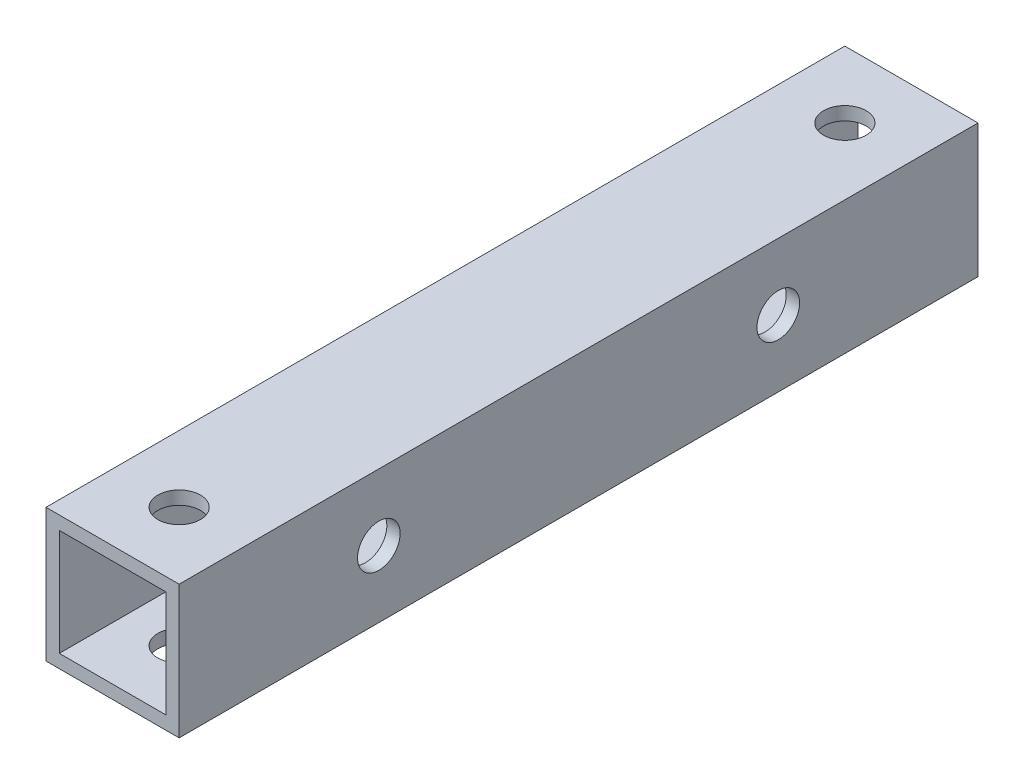
ISO-10303-21;
HEADER;
FILE_DESCRIPTION(('STEP AP214'),'2;1');
FILE_NAME('part.step','',(''),(''),'','','');
FILE_SCHEMA(('AUTOMOTIVE_DESIGN { 1 0 10303 214 1 1 1 1 }'));
ENDSEC;
DATA;
#1=APPLICATION_CONTEXT('core data for automotive mechanical design processes');
#2=APPLICATION_PROTOCOL_DEFINITION('international standard','automotive_design',2000,#1);
#3=PRODUCT_CONTEXT('',#1,'mechanical');
#4=PRODUCT('Part','Part','',(#3));
#5=PRODUCT_RELATED_PRODUCT_CATEGORY('part','',(#4));
#6=PRODUCT_DEFINITION_FORMATION('','',#4);
#7=PRODUCT_DEFINITION_CONTEXT('part definition',#1,'design');
#8=PRODUCT_DEFINITION('design','',#6,#7);
#9=PRODUCT_DEFINITION_SHAPE('','',#8);
#10=(LENGTH_UNIT() NAMED_UNIT(*) SI_UNIT(.MILLI.,.METRE.));
#11=(NAMED_UNIT(*) PLANE_ANGLE_UNIT() SI_UNIT($,.RADIAN.));
#12=(NAMED_UNIT(*) SI_UNIT($,.STERADIAN.) SOLID_ANGLE_UNIT());
#13=UNCERTAINTY_MEASURE_WITH_UNIT(LENGTH_MEASURE(1.E-05),#10,'distance_accuracy_value','');
#14=(GEOMETRIC_REPRESENTATION_CONTEXT(3) GLOBAL_UNCERTAINTY_ASSIGNED_CONTEXT((#13)) GLOBAL_UNIT_ASSIGNED_CONTEXT((#10,
#11,#12)) REPRESENTATION_CONTEXT('',''));
#15=CARTESIAN_POINT('',(0.,0.,0.));
#16=DIRECTION('',(0.,0.,1.));
#17=DIRECTION('',(1.,0.,0.));
#18=AXIS2_PLACEMENT_3D('',#15,#16,#17);
#19=CARTESIAN_POINT('',(0.,0.,30.));
#20=DIRECTION('',(0.,0.,1.));
#21=DIRECTION('',(1.,0.,0.));
#22=AXIS2_PLACEMENT_3D('',#19,#20,#21);
#23=PLANE('',#22);
#24=DIRECTION('',(0.,1.,0.));
#25=VECTOR('',#24,1.);
#26=CARTESIAN_POINT('',(5.,5.,30.));
#27=LINE('',#26,#25);
#28=CARTESIAN_POINT('',(5.,-5.,30.));
#29=VERTEX_POINT('',#28);
#30=CARTESIAN_POINT('',(5.,5.,30.));
#31=VERTEX_POINT('',#30);
#32=EDGE_CURVE('E185',#29,#31,#27,.T.);
#33=ORIENTED_EDGE('',*,*,#32,.T.);
#34=DIRECTION('',(-1.,0.,0.));
#35=VECTOR('',#34,1.);
#36=CARTESIAN_POINT('',(-5.,5.,30.));
#37=LINE('',#36,#35);
#38=CARTESIAN_POINT('',(-5.,5.,30.));
#39=VERTEX_POINT('',#38);
#40=EDGE_CURVE('E189',#31,#39,#37,.T.);
#41=ORIENTED_EDGE('',*,*,#40,.T.);
#42=DIRECTION('',(0.,-1.,0.));
#43=VECTOR('',#42,1.);
#44=CARTESIAN_POINT('',(-5.,5.,30.));
#45=LINE('',#44,#43);
#46=CARTESIAN_POINT('',(-5.,-5.,30.));
#47=VERTEX_POINT('',#46);
#48=EDGE_CURVE('E193',#39,#47,#45,.T.);
#49=ORIENTED_EDGE('',*,*,#48,.T.);
#50=DIRECTION('',(1.,0.,0.));
#51=VECTOR('',#50,1.);
#52=CARTESIAN_POINT('',(-5.,-5.,30.));
#53=LINE('',#52,#51);
#54=EDGE_CURVE('E196',#47,#29,#53,.T.);
#55=ORIENTED_EDGE('',*,*,#54,.T.);
#56=EDGE_LOOP('',(#33,#41,#49,#55));
#57=FACE_BOUND('',#56,.T.);
#58=DIRECTION('',(-1.,0.,0.));
#59=VECTOR('',#58,1.);
#60=CARTESIAN_POINT('',(-5.,4.,30.));
#61=LINE('',#60,#59);
#62=CARTESIAN_POINT('',(4.,4.,30.));
#63=VERTEX_POINT('',#62);
#64=CARTESIAN_POINT('',(-4.,4.,30.));
#65=VERTEX_POINT('',#64);
#66=EDGE_CURVE('E144',#63,#65,#61,.T.);
#67=ORIENTED_EDGE('',*,*,#66,.F.);
#68=DIRECTION('',(0.,1.,0.));
#69=VECTOR('',#68,1.);
#70=CARTESIAN_POINT('',(4.,5.,30.));
#71=LINE('',#70,#69);
#72=CARTESIAN_POINT('',(4.,-4.,30.));
#73=VERTEX_POINT('',#72);
#74=EDGE_CURVE('E135',#73,#63,#71,.T.);
#75=ORIENTED_EDGE('',*,*,#74,.F.);
#76=DIRECTION('',(1.,0.,0.));
#77=VECTOR('',#76,1.);
#78=CARTESIAN_POINT('',(-5.,-4.,30.));
#79=LINE('',#78,#77);
#80=CARTESIAN_POINT('',(-4.,-4.,30.));
#81=VERTEX_POINT('',#80);
#82=EDGE_CURVE('E161',#81,#73,#79,.T.);
#83=ORIENTED_EDGE('',*,*,#82,.F.);
#84=DIRECTION('',(0.,-1.,0.));
#85=VECTOR('',#84,1.);
#86=CARTESIAN_POINT('',(-4.,5.,30.));
#87=LINE('',#86,#85);
#88=EDGE_CURVE('E157',#65,#81,#87,.T.);
#89=ORIENTED_EDGE('',*,*,#88,.F.);
#90=EDGE_LOOP('',(#67,#75,#83,#89));
#91=FACE_BOUND('',#90,.T.);
#92=ADVANCED_FACE('F67',(#57,#91),#23,.T.);
#93=CARTESIAN_POINT('',(0.,0.,-30.));
#94=DIRECTION('',(0.,0.,1.));
#95=DIRECTION('',(1.,0.,0.));
#96=AXIS2_PLACEMENT_3D('',#93,#94,#95);
#97=PLANE('',#96);
#98=DIRECTION('',(0.,1.,0.));
#99=VECTOR('',#98,1.);
#100=CARTESIAN_POINT('',(5.,5.,-30.));
#101=LINE('',#100,#99);
#102=CARTESIAN_POINT('',(5.,-5.,-30.));
#103=VERTEX_POINT('',#102);
#104=CARTESIAN_POINT('',(5.,5.,-30.));
#105=VERTEX_POINT('',#104);
#106=EDGE_CURVE('E153',#103,#105,#101,.T.);
#107=ORIENTED_EDGE('',*,*,#106,.F.);
#108=DIRECTION('',(1.,0.,0.));
#109=VECTOR('',#108,1.);
#110=CARTESIAN_POINT('',(-5.,-5.,-30.));
#111=LINE('',#110,#109);
#112=CARTESIAN_POINT('',(-5.,-5.,-30.));
#113=VERTEX_POINT('',#112);
#114=EDGE_CURVE('E190',#113,#103,#111,.T.);
#115=ORIENTED_EDGE('',*,*,#114,.F.);
#116=DIRECTION('',(0.,-1.,0.));
#117=VECTOR('',#116,1.);
#118=CARTESIAN_POINT('',(-5.,5.,-30.));
#119=LINE('',#118,#117);
#120=CARTESIAN_POINT('',(-5.,5.,-30.));
#121=VERTEX_POINT('',#120);
#122=EDGE_CURVE('E206',#121,#113,#119,.T.);
#123=ORIENTED_EDGE('',*,*,#122,.F.);
#124=DIRECTION('',(-1.,0.,0.));
#125=VECTOR('',#124,1.);
#126=CARTESIAN_POINT('',(-5.,5.,-30.));
#127=LINE('',#126,#125);
#128=EDGE_CURVE('E203',#105,#121,#127,.T.);
#129=ORIENTED_EDGE('',*,*,#128,.F.);
#130=EDGE_LOOP('',(#107,#115,#123,#129));
#131=FACE_BOUND('',#130,.T.);
#132=DIRECTION('',(0.,1.,0.));
#133=VECTOR('',#132,1.);
#134=CARTESIAN_POINT('',(4.,5.,-30.));
#135=LINE('',#134,#133);
#136=CARTESIAN_POINT('',(4.,-4.,-30.));
#137=VERTEX_POINT('',#136);
#138=CARTESIAN_POINT('',(4.,4.,-30.));
#139=VERTEX_POINT('',#138);
#140=EDGE_CURVE('E93',#137,#139,#135,.T.);
#141=ORIENTED_EDGE('',*,*,#140,.T.);
#142=DIRECTION('',(-1.,0.,0.));
#143=VECTOR('',#142,1.);
#144=CARTESIAN_POINT('',(-5.,4.,-30.));
#145=LINE('',#144,#143);
#146=CARTESIAN_POINT('',(-4.,4.,-30.));
#147=VERTEX_POINT('',#146);
#148=EDGE_CURVE('E151',#139,#147,#145,.T.);
#149=ORIENTED_EDGE('',*,*,#148,.T.);
#150=DIRECTION('',(0.,-1.,0.));
#151=VECTOR('',#150,1.);
#152=CARTESIAN_POINT('',(-4.,5.,-30.));
#153=LINE('',#152,#151);
#154=CARTESIAN_POINT('',(-4.,-4.,-30.));
#155=VERTEX_POINT('',#154);
#156=EDGE_CURVE('E172',#147,#155,#153,.T.);
#157=ORIENTED_EDGE('',*,*,#156,.T.);
#158=DIRECTION('',(1.,0.,0.));
#159=VECTOR('',#158,1.);
#160=CARTESIAN_POINT('',(-5.,-4.,-30.));
#161=LINE('',#160,#159);
#162=EDGE_CURVE('E145',#155,#137,#161,.T.);
#163=ORIENTED_EDGE('',*,*,#162,.T.);
#164=EDGE_LOOP('',(#141,#149,#157,#163));
#165=FACE_BOUND('',#164,.T.);
#166=ADVANCED_FACE('F296',(#131,#165),#97,.F.);
#167=CARTESIAN_POINT('',(5.,5.,30.));
#168=DIRECTION('',(-1.,0.,0.));
#169=DIRECTION('',(0.,0.,1.));
#170=AXIS2_PLACEMENT_3D('',#167,#168,#169);
#171=PLANE('',#170);
#172=CARTESIAN_POINT('',(5.,0.,15.));
#173=DIRECTION('',(1.,0.,0.));
#174=DIRECTION('',(0.,0.,-1.));
#175=AXIS2_PLACEMENT_3D('',#172,#173,#174);
#176=CIRCLE('',#175,1.6);
#177=CARTESIAN_POINT('',(5.,0.,13.4));
#178=VERTEX_POINT('',#177);
#179=EDGE_CURVE('E407',#178,#178,#176,.T.);
#180=ORIENTED_EDGE('',*,*,#179,.F.);
#181=EDGE_LOOP('',(#180));
#182=FACE_BOUND('',#181,.T.);
#183=CARTESIAN_POINT('',(5.,0.,-15.));
#184=DIRECTION('',(-1.,0.,0.));
#185=DIRECTION('',(0.,0.,1.));
#186=AXIS2_PLACEMENT_3D('',#183,#184,#185);
#187=CIRCLE('',#186,1.6);
#188=CARTESIAN_POINT('',(5.,0.,-13.4));
#189=VERTEX_POINT('',#188);
#190=EDGE_CURVE('E231',#189,#189,#187,.T.);
#191=ORIENTED_EDGE('',*,*,#190,.T.);
#192=EDGE_LOOP('',(#191));
#193=FACE_BOUND('',#192,.T.);
#194=ORIENTED_EDGE('',*,*,#106,.T.);
#195=DIRECTION('',(0.,0.,-1.));
#196=VECTOR('',#195,1.);
#197=CARTESIAN_POINT('',(5.,5.,30.));
#198=LINE('',#197,#196);
#199=EDGE_CURVE('E12',#31,#105,#198,.T.);
#200=ORIENTED_EDGE('',*,*,#199,.F.);
#201=ORIENTED_EDGE('',*,*,#32,.F.);
#202=DIRECTION('',(0.,0.,-1.));
#203=VECTOR('',#202,1.);
#204=CARTESIAN_POINT('',(5.,-5.,30.));
#205=LINE('',#204,#203);
#206=EDGE_CURVE('E199',#29,#103,#205,.T.);
#207=ORIENTED_EDGE('',*,*,#206,.T.);
#208=EDGE_LOOP('',(#194,#200,#201,#207));
#209=FACE_BOUND('',#208,.T.);
#210=ADVANCED_FACE('F69',(#182,#193,#209),#171,.F.);
#211=CARTESIAN_POINT('',(-5.,5.,30.));
#212=DIRECTION('',(0.,-1.,0.));
#213=DIRECTION('',(0.,0.,-1.));
#214=AXIS2_PLACEMENT_3D('',#211,#212,#213);
#215=PLANE('',#214);
#216=CARTESIAN_POINT('',(0.,5.,25.));
#217=DIRECTION('',(0.,-1.,0.));
#218=DIRECTION('',(0.,0.,-1.));
#219=AXIS2_PLACEMENT_3D('',#216,#217,#218);
#220=CIRCLE('',#219,1.6);
#221=CARTESIAN_POINT('',(0.,5.,26.6));
#222=VERTEX_POINT('',#221);
#223=EDGE_CURVE('E242',#222,#222,#220,.F.);
#224=ORIENTED_EDGE('',*,*,#223,.F.);
#225=EDGE_LOOP('',(#224));
#226=FACE_BOUND('',#225,.T.);
#227=CARTESIAN_POINT('',(0.,5.,-25.));
#228=DIRECTION('',(0.,-1.,0.));
#229=DIRECTION('',(0.,0.,-1.));
#230=AXIS2_PLACEMENT_3D('',#227,#228,#229);
#231=CIRCLE('',#230,1.6);
#232=CARTESIAN_POINT('',(0.,5.,-23.4));
#233=VERTEX_POINT('',#232);
#234=EDGE_CURVE('E169',#233,#233,#231,.T.);
#235=ORIENTED_EDGE('',*,*,#234,.T.);
#236=EDGE_LOOP('',(#235));
#237=FACE_BOUND('',#236,.T.);
#238=ORIENTED_EDGE('',*,*,#128,.T.);
#239=DIRECTION('',(0.,0.,-1.));
#240=VECTOR('',#239,1.);
#241=CARTESIAN_POINT('',(-5.,5.,30.));
#242=LINE('',#241,#240);
#243=EDGE_CURVE('E77',#39,#121,#242,.T.);
#244=ORIENTED_EDGE('',*,*,#243,.F.);
#245=ORIENTED_EDGE('',*,*,#40,.F.);
#246=ORIENTED_EDGE('',*,*,#199,.T.);
#247=EDGE_LOOP('',(#238,#244,#245,#246));
#248=FACE_BOUND('',#247,.T.);
#249=ADVANCED_FACE('F276',(#226,#237,#248),#215,.F.);
#250=CARTESIAN_POINT('',(-5.,5.,30.));
#251=DIRECTION('',(1.,0.,0.));
#252=DIRECTION('',(0.,0.,-1.));
#253=AXIS2_PLACEMENT_3D('',#250,#251,#252);
#254=PLANE('',#253);
#255=CARTESIAN_POINT('',(-5.,0.,15.));
#256=DIRECTION('',(1.,0.,0.));
#257=DIRECTION('',(0.,0.,-1.));
#258=AXIS2_PLACEMENT_3D('',#255,#256,#257);
#259=CIRCLE('',#258,1.6);
#260=CARTESIAN_POINT('',(-5.,0.,13.4));
#261=VERTEX_POINT('',#260);
#262=EDGE_CURVE('E409',#261,#261,#259,.T.);
#263=ORIENTED_EDGE('',*,*,#262,.T.);
#264=EDGE_LOOP('',(#263));
#265=FACE_BOUND('',#264,.T.);
#266=CARTESIAN_POINT('',(-5.,0.,-15.));
#267=DIRECTION('',(-1.,0.,0.));
#268=DIRECTION('',(0.,0.,1.));
#269=AXIS2_PLACEMENT_3D('',#266,#267,#268);
#270=CIRCLE('',#269,1.6);
#271=CARTESIAN_POINT('',(-5.,0.,-13.4));
#272=VERTEX_POINT('',#271);
#273=EDGE_CURVE('E257',#272,#272,#270,.T.);
#274=ORIENTED_EDGE('',*,*,#273,.F.);
#275=EDGE_LOOP('',(#274));
#276=FACE_BOUND('',#275,.T.);
#277=ORIENTED_EDGE('',*,*,#122,.T.);
#278=DIRECTION('',(0.,0.,-1.));
#279=VECTOR('',#278,1.);
#280=CARTESIAN_POINT('',(-5.,-5.,30.));
#281=LINE('',#280,#279);
#282=EDGE_CURVE('E214',#47,#113,#281,.T.);
#283=ORIENTED_EDGE('',*,*,#282,.F.);
#284=ORIENTED_EDGE('',*,*,#48,.F.);
#285=ORIENTED_EDGE('',*,*,#243,.T.);
#286=EDGE_LOOP('',(#277,#283,#284,#285));
#287=FACE_BOUND('',#286,.T.);
#288=ADVANCED_FACE('F310',(#265,#276,#287),#254,.F.);
#289=CARTESIAN_POINT('',(-5.,-5.,30.));
#290=DIRECTION('',(0.,1.,0.));
#291=DIRECTION('',(0.,0.,1.));
#292=AXIS2_PLACEMENT_3D('',#289,#290,#291);
#293=PLANE('',#292);
#294=CARTESIAN_POINT('',(0.,-5.,25.));
#295=DIRECTION('',(0.,-1.,0.));
#296=DIRECTION('',(0.,0.,-1.));
#297=AXIS2_PLACEMENT_3D('',#294,#295,#296);
#298=CIRCLE('',#297,1.6);
#299=CARTESIAN_POINT('',(0.,-5.,23.4));
#300=VERTEX_POINT('',#299);
#301=EDGE_CURVE('E236',#300,#300,#298,.T.);
#302=ORIENTED_EDGE('',*,*,#301,.F.);
#303=EDGE_LOOP('',(#302));
#304=FACE_BOUND('',#303,.T.);
#305=CARTESIAN_POINT('',(0.,-5.,-25.));
#306=DIRECTION('',(0.,1.,0.));
#307=DIRECTION('',(0.,0.,1.));
#308=AXIS2_PLACEMENT_3D('',#305,#306,#307);
#309=CIRCLE('',#308,1.6);
#310=CARTESIAN_POINT('',(0.,-5.,-23.4));
#311=VERTEX_POINT('',#310);
#312=EDGE_CURVE('E226',#311,#311,#309,.T.);
#313=ORIENTED_EDGE('',*,*,#312,.T.);
#314=EDGE_LOOP('',(#313));
#315=FACE_BOUND('',#314,.T.);
#316=ORIENTED_EDGE('',*,*,#114,.T.);
#317=ORIENTED_EDGE('',*,*,#206,.F.);
#318=ORIENTED_EDGE('',*,*,#54,.F.);
#319=ORIENTED_EDGE('',*,*,#282,.T.);
#320=EDGE_LOOP('',(#316,#317,#318,#319));
#321=FACE_BOUND('',#320,.T.);
#322=ADVANCED_FACE('F307',(#304,#315,#321),#293,.F.);
#323=CARTESIAN_POINT('',(4.,5.,30.));
#324=DIRECTION('',(-1.,0.,0.));
#325=DIRECTION('',(0.,0.,1.));
#326=AXIS2_PLACEMENT_3D('',#323,#324,#325);
#327=PLANE('',#326);
#328=CARTESIAN_POINT('',(4.,0.,15.));
#329=DIRECTION('',(-1.,0.,0.));
#330=DIRECTION('',(0.,0.,1.));
#331=AXIS2_PLACEMENT_3D('',#328,#329,#330);
#332=CIRCLE('',#331,1.6);
#333=CARTESIAN_POINT('',(4.,0.,16.6));
#334=VERTEX_POINT('',#333);
#335=EDGE_CURVE('E245',#334,#334,#332,.F.);
#336=ORIENTED_EDGE('',*,*,#335,.T.);
#337=EDGE_LOOP('',(#336));
#338=FACE_BOUND('',#337,.T.);
#339=CARTESIAN_POINT('',(4.,0.,-15.));
#340=DIRECTION('',(-1.,0.,0.));
#341=DIRECTION('',(0.,0.,1.));
#342=AXIS2_PLACEMENT_3D('',#339,#340,#341);
#343=CIRCLE('',#342,1.6);
#344=CARTESIAN_POINT('',(4.,0.,-13.4));
#345=VERTEX_POINT('',#344);
#346=EDGE_CURVE('E230',#345,#345,#343,.T.);
#347=ORIENTED_EDGE('',*,*,#346,.F.);
#348=EDGE_LOOP('',(#347));
#349=FACE_BOUND('',#348,.T.);
#350=ORIENTED_EDGE('',*,*,#140,.F.);
#351=DIRECTION('',(0.,0.,-1.));
#352=VECTOR('',#351,1.);
#353=CARTESIAN_POINT('',(4.,-4.,30.));
#354=LINE('',#353,#352);
#355=EDGE_CURVE('E139',#73,#137,#354,.T.);
#356=ORIENTED_EDGE('',*,*,#355,.F.);
#357=ORIENTED_EDGE('',*,*,#74,.T.);
#358=DIRECTION('',(0.,0.,-1.));
#359=VECTOR('',#358,1.);
#360=CARTESIAN_POINT('',(4.,4.,30.));
#361=LINE('',#360,#359);
#362=EDGE_CURVE('E138',#63,#139,#361,.T.);
#363=ORIENTED_EDGE('',*,*,#362,.T.);
#364=EDGE_LOOP('',(#350,#356,#357,#363));
#365=FACE_BOUND('',#364,.T.);
#366=ADVANCED_FACE('F137',(#338,#349,#365),#327,.T.);
#367=CARTESIAN_POINT('',(-5.,4.,30.));
#368=DIRECTION('',(0.,-1.,0.));
#369=DIRECTION('',(0.,0.,-1.));
#370=AXIS2_PLACEMENT_3D('',#367,#368,#369);
#371=PLANE('',#370);
#372=CARTESIAN_POINT('',(0.,4.,25.));
#373=DIRECTION('',(0.,-1.,0.));
#374=DIRECTION('',(0.,0.,-1.));
#375=AXIS2_PLACEMENT_3D('',#372,#373,#374);
#376=CIRCLE('',#375,1.6);
#377=CARTESIAN_POINT('',(0.,4.,26.6));
#378=VERTEX_POINT('',#377);
#379=EDGE_CURVE('E235',#378,#378,#376,.F.);
#380=ORIENTED_EDGE('',*,*,#379,.T.);
#381=EDGE_LOOP('',(#380));
#382=FACE_BOUND('',#381,.T.);
#383=CARTESIAN_POINT('',(0.,4.,-25.));
#384=DIRECTION('',(0.,-1.,0.));
#385=DIRECTION('',(0.,0.,-1.));
#386=AXIS2_PLACEMENT_3D('',#383,#384,#385);
#387=CIRCLE('',#386,1.6);
#388=CARTESIAN_POINT('',(0.,4.,-23.4));
#389=VERTEX_POINT('',#388);
#390=EDGE_CURVE('E225',#389,#389,#387,.T.);
#391=ORIENTED_EDGE('',*,*,#390,.F.);
#392=EDGE_LOOP('',(#391));
#393=FACE_BOUND('',#392,.T.);
#394=ORIENTED_EDGE('',*,*,#148,.F.);
#395=ORIENTED_EDGE('',*,*,#362,.F.);
#396=ORIENTED_EDGE('',*,*,#66,.T.);
#397=DIRECTION('',(0.,0.,-1.));
#398=VECTOR('',#397,1.);
#399=CARTESIAN_POINT('',(-4.,4.,30.));
#400=LINE('',#399,#398);
#401=EDGE_CURVE('E154',#65,#147,#400,.T.);
#402=ORIENTED_EDGE('',*,*,#401,.T.);
#403=EDGE_LOOP('',(#394,#395,#396,#402));
#404=FACE_BOUND('',#403,.T.);
#405=ADVANCED_FACE('F148',(#382,#393,#404),#371,.T.);
#406=CARTESIAN_POINT('',(-4.,5.,30.));
#407=DIRECTION('',(1.,0.,0.));
#408=DIRECTION('',(0.,0.,-1.));
#409=AXIS2_PLACEMENT_3D('',#406,#407,#408);
#410=PLANE('',#409);
#411=CARTESIAN_POINT('',(-4.,0.,15.));
#412=DIRECTION('',(1.,0.,0.));
#413=DIRECTION('',(0.,0.,-1.));
#414=AXIS2_PLACEMENT_3D('',#411,#412,#413);
#415=CIRCLE('',#414,1.6);
#416=CARTESIAN_POINT('',(-4.,0.,13.4));
#417=VERTEX_POINT('',#416);
#418=EDGE_CURVE('E71',#417,#417,#415,.F.);
#419=ORIENTED_EDGE('',*,*,#418,.T.);
#420=EDGE_LOOP('',(#419));
#421=FACE_BOUND('',#420,.T.);
#422=CARTESIAN_POINT('',(-4.,0.,-15.));
#423=DIRECTION('',(1.,0.,0.));
#424=DIRECTION('',(0.,0.,-1.));
#425=AXIS2_PLACEMENT_3D('',#422,#423,#424);
#426=CIRCLE('',#425,1.6);
#427=CARTESIAN_POINT('',(-4.,0.,-16.6));
#428=VERTEX_POINT('',#427);
#429=EDGE_CURVE('E227',#428,#428,#426,.T.);
#430=ORIENTED_EDGE('',*,*,#429,.F.);
#431=EDGE_LOOP('',(#430));
#432=FACE_BOUND('',#431,.T.);
#433=ORIENTED_EDGE('',*,*,#156,.F.);
#434=ORIENTED_EDGE('',*,*,#401,.F.);
#435=ORIENTED_EDGE('',*,*,#88,.T.);
#436=DIRECTION('',(0.,0.,-1.));
#437=VECTOR('',#436,1.);
#438=CARTESIAN_POINT('',(-4.,-4.,30.));
#439=LINE('',#438,#437);
#440=EDGE_CURVE('E85',#81,#155,#439,.T.);
#441=ORIENTED_EDGE('',*,*,#440,.T.);
#442=EDGE_LOOP('',(#433,#434,#435,#441));
#443=FACE_BOUND('',#442,.T.);
#444=ADVANCED_FACE('F340',(#421,#432,#443),#410,.T.);
#445=CARTESIAN_POINT('',(-5.,-4.,30.));
#446=DIRECTION('',(0.,1.,0.));
#447=DIRECTION('',(0.,0.,1.));
#448=AXIS2_PLACEMENT_3D('',#445,#446,#447);
#449=PLANE('',#448);
#450=CARTESIAN_POINT('',(0.,-4.,25.));
#451=DIRECTION('',(0.,1.,0.));
#452=DIRECTION('',(0.,0.,1.));
#453=AXIS2_PLACEMENT_3D('',#450,#451,#452);
#454=CIRCLE('',#453,1.6);
#455=CARTESIAN_POINT('',(0.,-4.,26.6));
#456=VERTEX_POINT('',#455);
#457=EDGE_CURVE('E232',#456,#456,#454,.F.);
#458=ORIENTED_EDGE('',*,*,#457,.T.);
#459=EDGE_LOOP('',(#458));
#460=FACE_BOUND('',#459,.T.);
#461=CARTESIAN_POINT('',(0.,-4.,-25.));
#462=DIRECTION('',(0.,1.,0.));
#463=DIRECTION('',(0.,0.,1.));
#464=AXIS2_PLACEMENT_3D('',#461,#462,#463);
#465=CIRCLE('',#464,1.6);
#466=CARTESIAN_POINT('',(0.,-4.,-23.4));
#467=VERTEX_POINT('',#466);
#468=EDGE_CURVE('E221',#467,#467,#465,.T.);
#469=ORIENTED_EDGE('',*,*,#468,.F.);
#470=EDGE_LOOP('',(#469));
#471=FACE_BOUND('',#470,.T.);
#472=ORIENTED_EDGE('',*,*,#162,.F.);
#473=ORIENTED_EDGE('',*,*,#440,.F.);
#474=ORIENTED_EDGE('',*,*,#82,.T.);
#475=ORIENTED_EDGE('',*,*,#355,.T.);
#476=EDGE_LOOP('',(#472,#473,#474,#475));
#477=FACE_BOUND('',#476,.T.);
#478=ADVANCED_FACE('F292',(#460,#471,#477),#449,.T.);
#479=CARTESIAN_POINT('',(0.,-5.,-25.));
#480=DIRECTION('',(0.,1.,0.));
#481=DIRECTION('',(0.,0.,1.));
#482=AXIS2_PLACEMENT_3D('',#479,#480,#481);
#483=CYLINDRICAL_SURFACE('',#482,1.6);
#484=ORIENTED_EDGE('',*,*,#468,.T.);
#485=EDGE_LOOP('',(#484));
#486=FACE_BOUND('',#485,.T.);
#487=ORIENTED_EDGE('',*,*,#312,.F.);
#488=EDGE_LOOP('',(#487));
#489=FACE_BOUND('',#488,.T.);
#490=ADVANCED_FACE('F282',(#486,#489),#483,.F.);
#491=CARTESIAN_POINT('',(0.,4.,-23.4));
#492=CARTESIAN_POINT('',(0.,4.01041666666667,-23.4));
#493=CARTESIAN_POINT('',(0.,4.02083333333334,-23.4));
#494=CARTESIAN_POINT('',(0.,4.04166666666667,-23.4));
#495=CARTESIAN_POINT('',(0.,4.05208333333334,-23.4));
#496=CARTESIAN_POINT('',(0.,4.07291666666667,-23.4));
#497=CARTESIAN_POINT('',(0.,4.08333333333334,-23.4));
#498=CARTESIAN_POINT('',(0.,4.10416666666667,-23.4));
#499=CARTESIAN_POINT('',(0.,4.11458333333334,-23.4));
#500=CARTESIAN_POINT('',(0.,4.13541666666667,-23.4));
#501=CARTESIAN_POINT('',(0.,4.14583333333334,-23.4));
#502=CARTESIAN_POINT('',(0.,4.16666666666667,-23.4));
#503=CARTESIAN_POINT('',(0.,4.17708333333334,-23.4));
#504=CARTESIAN_POINT('',(0.,4.19791666666667,-23.4));
#505=CARTESIAN_POINT('',(0.,4.20833333333334,-23.4));
#506=CARTESIAN_POINT('',(0.,4.22916666666667,-23.4));
#507=CARTESIAN_POINT('',(0.,4.23958333333334,-23.4));
#508=CARTESIAN_POINT('',(0.,4.26041666666667,-23.4));
#509=CARTESIAN_POINT('',(0.,4.27083333333334,-23.4));
#510=CARTESIAN_POINT('',(0.,4.29166666666667,-23.4));
#511=CARTESIAN_POINT('',(0.,4.30208333333334,-23.4));
#512=CARTESIAN_POINT('',(0.,4.32291666666667,-23.4));
#513=CARTESIAN_POINT('',(0.,4.33333333333334,-23.4));
#514=CARTESIAN_POINT('',(0.,4.35416666666667,-23.4));
#515=CARTESIAN_POINT('',(0.,4.36458333333334,-23.4));
#516=CARTESIAN_POINT('',(0.,4.38541666666667,-23.4));
#517=CARTESIAN_POINT('',(0.,4.39583333333334,-23.4));
#518=CARTESIAN_POINT('',(0.,4.41666666666667,-23.4));
#519=CARTESIAN_POINT('',(0.,4.42708333333334,-23.4));
#520=CARTESIAN_POINT('',(0.,4.44791666666667,-23.4));
#521=CARTESIAN_POINT('',(0.,4.45833333333334,-23.4));
#522=CARTESIAN_POINT('',(0.,4.47916666666667,-23.4));
#523=CARTESIAN_POINT('',(0.,4.48958333333334,-23.4));
#524=CARTESIAN_POINT('',(0.,4.51041666666667,-23.4));
#525=CARTESIAN_POINT('',(0.,4.52083333333334,-23.4));
#526=CARTESIAN_POINT('',(0.,4.54166666666667,-23.4));
#527=CARTESIAN_POINT('',(0.,4.55208333333334,-23.4));
#528=CARTESIAN_POINT('',(0.,4.57291666666667,-23.4));
#529=CARTESIAN_POINT('',(0.,4.58333333333334,-23.4));
#530=CARTESIAN_POINT('',(0.,4.60416666666667,-23.4));
#531=CARTESIAN_POINT('',(0.,4.61458333333334,-23.4));
#532=CARTESIAN_POINT('',(0.,4.63541666666667,-23.4));
#533=CARTESIAN_POINT('',(0.,4.64583333333334,-23.4));
#534=CARTESIAN_POINT('',(0.,4.66666666666667,-23.4));
#535=CARTESIAN_POINT('',(0.,4.67708333333334,-23.4));
#536=CARTESIAN_POINT('',(0.,4.69791666666667,-23.4));
#537=CARTESIAN_POINT('',(0.,4.70833333333334,-23.4));
#538=CARTESIAN_POINT('',(0.,4.72916666666667,-23.4));
#539=CARTESIAN_POINT('',(0.,4.73958333333334,-23.4));
#540=CARTESIAN_POINT('',(0.,4.76041666666667,-23.4));
#541=CARTESIAN_POINT('',(0.,4.77083333333334,-23.4));
#542=CARTESIAN_POINT('',(0.,4.79166666666667,-23.4));
#543=CARTESIAN_POINT('',(0.,4.80208333333334,-23.4));
#544=CARTESIAN_POINT('',(0.,4.82291666666667,-23.4));
#545=CARTESIAN_POINT('',(0.,4.83333333333334,-23.4));
#546=CARTESIAN_POINT('',(0.,4.85416666666667,-23.4));
#547=CARTESIAN_POINT('',(0.,4.86458333333334,-23.4));
#548=CARTESIAN_POINT('',(0.,4.88541666666667,-23.4));
#549=CARTESIAN_POINT('',(0.,4.89583333333334,-23.4));
#550=CARTESIAN_POINT('',(0.,4.91666666666667,-23.4));
#551=CARTESIAN_POINT('',(0.,4.92708333333334,-23.4));
#552=CARTESIAN_POINT('',(0.,4.94791666666667,-23.4));
#553=CARTESIAN_POINT('',(0.,4.95833333333334,-23.4));
#554=CARTESIAN_POINT('',(0.,4.97916666666667,-23.4));
#555=CARTESIAN_POINT('',(0.,4.98958333333334,-23.4));
#556=CARTESIAN_POINT('',(0.,5.,-23.4));
#557=B_SPLINE_CURVE_WITH_KNOTS('',3,(#491,#492,#493,#494,#495,#496,#497,#498,#499,#500,#501,
#502,#503,#504,#505,#506,#507,#508,#509,#510,#511,#512,#513,#514,#515,#516,#517,#518,#519,#520,
#521,#522,#523,#524,#525,#526,#527,#528,#529,#530,#531,#532,#533,#534,#535,#536,#537,#538,#539,
#540,#541,#542,#543,#544,#545,#546,#547,#548,#549,#550,#551,#552,#553,#554,#555,#556),
.UNSPECIFIED.,.F.,.F.,(4,2,2,2,2,2,2,2,2,2,2,2,2,2,2,2,2,2,2,2,2,2,2,2,2,2,2,2,2,2,2,2,4),(0.,
0.03125,0.0625000000000001,0.0937500000000001,0.125,0.15625,0.1875,0.21875,0.25,0.28125,0.3125,
0.34375,0.375,0.40625,0.4375,0.46875,0.5,0.53125,0.5625,0.593750000000001,0.625000000000001,
0.656250000000001,0.687500000000001,0.718750000000001,0.750000000000001,0.781250000000001,
0.812500000000001,0.843750000000001,0.875000000000001,0.906250000000001,0.937500000000001,
0.968750000000001,1.),.UNSPECIFIED.);
#558=EDGE_CURVE('BSEAM279',#389,#233,#557,.T.);
#559=ORIENTED_EDGE('',*,*,#390,.T.);
#560=ORIENTED_EDGE('',*,*,#234,.F.);
#561=ORIENTED_EDGE('',*,*,#558,.T.);
#562=ORIENTED_EDGE('',*,*,#558,.F.);
#563=EDGE_LOOP('',(#559,#561,#560,#562));
#564=FACE_BOUND('',#563,.T.);
#565=ADVANCED_FACE('F279',(#564),#483,.F.);
#566=CARTESIAN_POINT('',(5.,0.,-15.));
#567=DIRECTION('',(-1.,0.,0.));
#568=DIRECTION('',(0.,0.,1.));
#569=AXIS2_PLACEMENT_3D('',#566,#567,#568);
#570=CYLINDRICAL_SURFACE('',#569,1.6);
#571=ORIENTED_EDGE('',*,*,#429,.T.);
#572=EDGE_LOOP('',(#571));
#573=FACE_BOUND('',#572,.T.);
#574=ORIENTED_EDGE('',*,*,#273,.T.);
#575=EDGE_LOOP('',(#574));
#576=FACE_BOUND('',#575,.T.);
#577=ADVANCED_FACE('F281',(#573,#576),#570,.F.);
#578=ORIENTED_EDGE('',*,*,#346,.T.);
#579=EDGE_LOOP('',(#578));
#580=FACE_BOUND('',#579,.T.);
#581=ORIENTED_EDGE('',*,*,#190,.F.);
#582=EDGE_LOOP('',(#581));
#583=FACE_BOUND('',#582,.T.);
#584=ADVANCED_FACE('F289',(#580,#583),#570,.F.);
#585=CARTESIAN_POINT('',(0.,-5.,25.));
#586=DIRECTION('',(0.,1.,0.));
#587=DIRECTION('',(0.,0.,1.));
#588=AXIS2_PLACEMENT_3D('',#585,#586,#587);
#589=CYLINDRICAL_SURFACE('',#588,1.6);
#590=ORIENTED_EDGE('',*,*,#457,.F.);
#591=EDGE_LOOP('',(#590));
#592=FACE_BOUND('',#591,.T.);
#593=ORIENTED_EDGE('',*,*,#301,.T.);
#594=EDGE_LOOP('',(#593));
#595=FACE_BOUND('',#594,.T.);
#596=ADVANCED_FACE('F325',(#592,#595),#589,.F.);
#597=CARTESIAN_POINT('',(0.,4.,26.6));
#598=CARTESIAN_POINT('',(0.,4.01041666666667,26.6));
#599=CARTESIAN_POINT('',(0.,4.02083333333334,26.6));
#600=CARTESIAN_POINT('',(0.,4.04166666666667,26.6));
#601=CARTESIAN_POINT('',(0.,4.05208333333334,26.6));
#602=CARTESIAN_POINT('',(0.,4.07291666666667,26.6));
#603=CARTESIAN_POINT('',(0.,4.08333333333334,26.6));
#604=CARTESIAN_POINT('',(0.,4.10416666666667,26.6));
#605=CARTESIAN_POINT('',(0.,4.11458333333334,26.6));
#606=CARTESIAN_POINT('',(0.,4.13541666666667,26.6));
#607=CARTESIAN_POINT('',(0.,4.14583333333334,26.6));
#608=CARTESIAN_POINT('',(0.,4.16666666666667,26.6));
#609=CARTESIAN_POINT('',(0.,4.17708333333334,26.6));
#610=CARTESIAN_POINT('',(0.,4.19791666666667,26.6));
#611=CARTESIAN_POINT('',(0.,4.20833333333334,26.6));
#612=CARTESIAN_POINT('',(0.,4.22916666666667,26.6));
#613=CARTESIAN_POINT('',(0.,4.23958333333334,26.6));
#614=CARTESIAN_POINT('',(0.,4.26041666666667,26.6));
#615=CARTESIAN_POINT('',(0.,4.27083333333334,26.6));
#616=CARTESIAN_POINT('',(0.,4.29166666666667,26.6));
#617=CARTESIAN_POINT('',(0.,4.30208333333334,26.6));
#618=CARTESIAN_POINT('',(0.,4.32291666666667,26.6));
#619=CARTESIAN_POINT('',(0.,4.33333333333334,26.6));
#620=CARTESIAN_POINT('',(0.,4.35416666666667,26.6));
#621=CARTESIAN_POINT('',(0.,4.36458333333334,26.6));
#622=CARTESIAN_POINT('',(0.,4.38541666666667,26.6));
#623=CARTESIAN_POINT('',(0.,4.39583333333334,26.6));
#624=CARTESIAN_POINT('',(0.,4.41666666666667,26.6));
#625=CARTESIAN_POINT('',(0.,4.42708333333334,26.6));
#626=CARTESIAN_POINT('',(0.,4.44791666666667,26.6));
#627=CARTESIAN_POINT('',(0.,4.45833333333334,26.6));
#628=CARTESIAN_POINT('',(0.,4.47916666666667,26.6));
#629=CARTESIAN_POINT('',(0.,4.48958333333334,26.6));
#630=CARTESIAN_POINT('',(0.,4.51041666666667,26.6));
#631=CARTESIAN_POINT('',(0.,4.52083333333334,26.6));
#632=CARTESIAN_POINT('',(0.,4.54166666666667,26.6));
#633=CARTESIAN_POINT('',(0.,4.55208333333334,26.6));
#634=CARTESIAN_POINT('',(0.,4.57291666666667,26.6));
#635=CARTESIAN_POINT('',(0.,4.58333333333334,26.6));
#636=CARTESIAN_POINT('',(0.,4.60416666666667,26.6));
#637=CARTESIAN_POINT('',(0.,4.61458333333334,26.6));
#638=CARTESIAN_POINT('',(0.,4.63541666666667,26.6));
#639=CARTESIAN_POINT('',(0.,4.64583333333334,26.6));
#640=CARTESIAN_POINT('',(0.,4.66666666666667,26.6));
#641=CARTESIAN_POINT('',(0.,4.67708333333334,26.6));
#642=CARTESIAN_POINT('',(0.,4.69791666666667,26.6));
#643=CARTESIAN_POINT('',(0.,4.70833333333334,26.6));
#644=CARTESIAN_POINT('',(0.,4.72916666666667,26.6));
#645=CARTESIAN_POINT('',(0.,4.73958333333334,26.6));
#646=CARTESIAN_POINT('',(0.,4.76041666666667,26.6));
#647=CARTESIAN_POINT('',(0.,4.77083333333334,26.6));
#648=CARTESIAN_POINT('',(0.,4.79166666666667,26.6));
#649=CARTESIAN_POINT('',(0.,4.80208333333334,26.6));
#650=CARTESIAN_POINT('',(0.,4.82291666666667,26.6));
#651=CARTESIAN_POINT('',(0.,4.83333333333334,26.6));
#652=CARTESIAN_POINT('',(0.,4.85416666666667,26.6));
#653=CARTESIAN_POINT('',(0.,4.86458333333334,26.6));
#654=CARTESIAN_POINT('',(0.,4.88541666666667,26.6));
#655=CARTESIAN_POINT('',(0.,4.89583333333334,26.6));
#656=CARTESIAN_POINT('',(0.,4.91666666666667,26.6));
#657=CARTESIAN_POINT('',(0.,4.92708333333334,26.6));
#658=CARTESIAN_POINT('',(0.,4.94791666666667,26.6));
#659=CARTESIAN_POINT('',(0.,4.95833333333334,26.6));
#660=CARTESIAN_POINT('',(0.,4.97916666666667,26.6));
#661=CARTESIAN_POINT('',(0.,4.98958333333334,26.6));
#662=CARTESIAN_POINT('',(0.,5.,26.6));
#663=B_SPLINE_CURVE_WITH_KNOTS('',3,(#597,#598,#599,#600,#601,#602,#603,#604,#605,#606,#607,
#608,#609,#610,#611,#612,#613,#614,#615,#616,#617,#618,#619,#620,#621,#622,#623,#624,#625,#626,
#627,#628,#629,#630,#631,#632,#633,#634,#635,#636,#637,#638,#639,#640,#641,#642,#643,#644,#645,
#646,#647,#648,#649,#650,#651,#652,#653,#654,#655,#656,#657,#658,#659,#660,#661,#662),
.UNSPECIFIED.,.F.,.F.,(4,2,2,2,2,2,2,2,2,2,2,2,2,2,2,2,2,2,2,2,2,2,2,2,2,2,2,2,2,2,2,2,4),(0.,
0.03125,0.0625000000000001,0.0937500000000001,0.125,0.15625,0.1875,0.21875,0.25,0.28125,0.3125,
0.34375,0.375,0.40625,0.4375,0.46875,0.5,0.53125,0.5625,0.593750000000001,0.625000000000001,
0.656250000000001,0.687500000000001,0.718750000000001,0.750000000000001,0.781250000000001,
0.812500000000001,0.843750000000001,0.875000000000001,0.906250000000001,0.937500000000001,
0.968750000000001,1.),.UNSPECIFIED.);
#664=EDGE_CURVE('BSEAM322',#378,#222,#663,.T.);
#665=ORIENTED_EDGE('',*,*,#379,.F.);
#666=ORIENTED_EDGE('',*,*,#223,.T.);
#667=ORIENTED_EDGE('',*,*,#664,.T.);
#668=ORIENTED_EDGE('',*,*,#664,.F.);
#669=EDGE_LOOP('',(#665,#667,#666,#668));
#670=FACE_BOUND('',#669,.T.);
#671=ADVANCED_FACE('F322',(#670),#589,.F.);
#672=CARTESIAN_POINT('',(5.,0.,15.));
#673=DIRECTION('',(-1.,0.,0.));
#674=DIRECTION('',(0.,0.,1.));
#675=AXIS2_PLACEMENT_3D('',#672,#673,#674);
#676=CYLINDRICAL_SURFACE('',#675,1.6);
#677=ORIENTED_EDGE('',*,*,#418,.F.);
#678=EDGE_LOOP('',(#677));
#679=FACE_BOUND('',#678,.T.);
#680=ORIENTED_EDGE('',*,*,#262,.F.);
#681=EDGE_LOOP('',(#680));
#682=FACE_BOUND('',#681,.T.);
#683=ADVANCED_FACE('F324',(#679,#682),#676,.F.);
#684=ORIENTED_EDGE('',*,*,#335,.F.);
#685=EDGE_LOOP('',(#684));
#686=FACE_BOUND('',#685,.T.);
#687=ORIENTED_EDGE('',*,*,#179,.T.);
#688=EDGE_LOOP('',(#687));
#689=FACE_BOUND('',#688,.T.);
#690=ADVANCED_FACE('F332',(#686,#689),#676,.F.);
#691=CLOSED_SHELL('',(#92,#166,#210,#249,#288,#322,#366,#405,#444,#478,#490,#565,#577,#584,#596,
#671,#683,#690));
#692=MANIFOLD_SOLID_BREP('B2',#691);
#693=ADVANCED_BREP_SHAPE_REPRESENTATION('',(#18,#692),#14);
#694=SHAPE_DEFINITION_REPRESENTATION(#9,#693);
ENDSEC;
END-ISO-10303-21;
